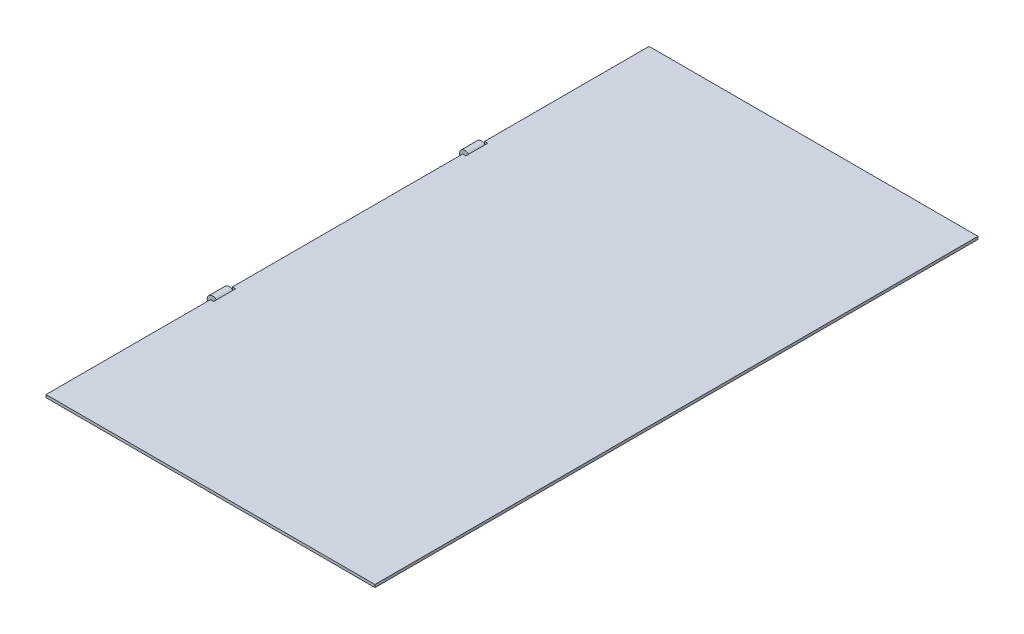
ISO-10303-21;
HEADER;
FILE_DESCRIPTION(('STEP AP214'),'2;1');
FILE_NAME('part.step','',(''),(''),'','','');
FILE_SCHEMA(('AUTOMOTIVE_DESIGN { 1 0 10303 214 1 1 1 1 }'));
ENDSEC;
DATA;
#1=APPLICATION_CONTEXT('core data for automotive mechanical design processes');
#2=APPLICATION_PROTOCOL_DEFINITION('international standard','automotive_design',2000,#1);
#3=PRODUCT_CONTEXT('',#1,'mechanical');
#4=PRODUCT('Part','Part','',(#3));
#5=PRODUCT_RELATED_PRODUCT_CATEGORY('part','',(#4));
#6=PRODUCT_DEFINITION_FORMATION('','',#4);
#7=PRODUCT_DEFINITION_CONTEXT('part definition',#1,'design');
#8=PRODUCT_DEFINITION('design','',#6,#7);
#9=PRODUCT_DEFINITION_SHAPE('','',#8);
#10=(LENGTH_UNIT() NAMED_UNIT(*) SI_UNIT(.MILLI.,.METRE.));
#11=(NAMED_UNIT(*) PLANE_ANGLE_UNIT() SI_UNIT($,.RADIAN.));
#12=(NAMED_UNIT(*) SI_UNIT($,.STERADIAN.) SOLID_ANGLE_UNIT());
#13=UNCERTAINTY_MEASURE_WITH_UNIT(LENGTH_MEASURE(1.E-05),#10,'distance_accuracy_value','');
#14=(GEOMETRIC_REPRESENTATION_CONTEXT(3) GLOBAL_UNCERTAINTY_ASSIGNED_CONTEXT((#13)) GLOBAL_UNIT_ASSIGNED_CONTEXT((#10,
#11,#12)) REPRESENTATION_CONTEXT('',''));
#15=CARTESIAN_POINT('',(0.,0.,0.));
#16=DIRECTION('',(0.,0.,1.));
#17=DIRECTION('',(1.,0.,0.));
#18=AXIS2_PLACEMENT_3D('',#15,#16,#17);
#19=CARTESIAN_POINT('',(0.,2.5,-550.));
#20=DIRECTION('',(0.,-1.,0.));
#21=DIRECTION('',(0.,0.,-1.));
#22=AXIS2_PLACEMENT_3D('',#19,#20,#21);
#23=PLANE('',#22);
#24=DIRECTION('',(1.,0.,0.));
#25=VECTOR('',#24,1.);
#26=CARTESIAN_POINT('',(0.,2.5,-400.));
#27=LINE('',#26,#25);
#28=CARTESIAN_POINT('',(0.,2.5,-400.));
#29=VERTEX_POINT('',#28);
#30=CARTESIAN_POINT('',(2.93475806736018,2.5,-400.));
#31=VERTEX_POINT('',#30);
#32=EDGE_CURVE('E329',#29,#31,#27,.T.);
#33=ORIENTED_EDGE('',*,*,#32,.T.);
#34=DIRECTION('',(0.,0.,1.));
#35=VECTOR('',#34,1.);
#36=CARTESIAN_POINT('',(2.93475806736018,2.5,-400.));
#37=LINE('',#36,#35);
#38=CARTESIAN_POINT('',(2.93475806736018,2.5,-397.5));
#39=VERTEX_POINT('',#38);
#40=EDGE_CURVE('E179',#31,#39,#37,.T.);
#41=ORIENTED_EDGE('',*,*,#40,.T.);
#42=DIRECTION('',(0.,0.,-1.));
#43=VECTOR('',#42,1.);
#44=CARTESIAN_POINT('',(2.93475806736018,2.5,-382.5));
#45=LINE('',#44,#43);
#46=CARTESIAN_POINT('',(2.93475806736018,2.5,-382.5));
#47=VERTEX_POINT('',#46);
#48=EDGE_CURVE('E196',#47,#39,#45,.T.);
#49=ORIENTED_EDGE('',*,*,#48,.F.);
#50=DIRECTION('',(0.,0.,-1.));
#51=VECTOR('',#50,1.);
#52=CARTESIAN_POINT('',(2.93475806736018,2.5,-380.));
#53=LINE('',#52,#51);
#54=CARTESIAN_POINT('',(2.93475806736018,2.5,-380.));
#55=VERTEX_POINT('',#54);
#56=EDGE_CURVE('E322',#55,#47,#53,.T.);
#57=ORIENTED_EDGE('',*,*,#56,.F.);
#58=DIRECTION('',(-1.,0.,0.));
#59=VECTOR('',#58,1.);
#60=CARTESIAN_POINT('',(0.,2.5,-380.));
#61=LINE('',#60,#59);
#62=CARTESIAN_POINT('',(0.,2.5,-380.));
#63=VERTEX_POINT('',#62);
#64=EDGE_CURVE('E317',#55,#63,#61,.T.);
#65=ORIENTED_EDGE('',*,*,#64,.T.);
#66=DIRECTION('',(0.,0.,1.));
#67=VECTOR('',#66,1.);
#68=CARTESIAN_POINT('',(0.,2.5,0.));
#69=LINE('',#68,#67);
#70=CARTESIAN_POINT('',(0.,2.5,-170.));
#71=VERTEX_POINT('',#70);
#72=EDGE_CURVE('E223',#63,#71,#69,.T.);
#73=ORIENTED_EDGE('',*,*,#72,.T.);
#74=DIRECTION('',(1.,0.,0.));
#75=VECTOR('',#74,1.);
#76=CARTESIAN_POINT('',(0.,2.5,-170.));
#77=LINE('',#76,#75);
#78=CARTESIAN_POINT('',(2.93475806736018,2.5,-170.));
#79=VERTEX_POINT('',#78);
#80=EDGE_CURVE('E303',#71,#79,#77,.T.);
#81=ORIENTED_EDGE('',*,*,#80,.T.);
#82=DIRECTION('',(0.,0.,1.));
#83=VECTOR('',#82,1.);
#84=CARTESIAN_POINT('',(2.93475806736018,2.5,-170.));
#85=LINE('',#84,#83);
#86=CARTESIAN_POINT('',(2.93475806736018,2.5,-167.5));
#87=VERTEX_POINT('',#86);
#88=EDGE_CURVE('E309',#79,#87,#85,.T.);
#89=ORIENTED_EDGE('',*,*,#88,.T.);
#90=DIRECTION('',(0.,0.,1.));
#91=VECTOR('',#90,1.);
#92=CARTESIAN_POINT('',(2.93475806736018,2.5,-167.5));
#93=LINE('',#92,#91);
#94=CARTESIAN_POINT('',(2.93475806736018,2.5,-152.5));
#95=VERTEX_POINT('',#94);
#96=EDGE_CURVE('E235',#87,#95,#93,.T.);
#97=ORIENTED_EDGE('',*,*,#96,.T.);
#98=DIRECTION('',(0.,0.,-1.));
#99=VECTOR('',#98,1.);
#100=CARTESIAN_POINT('',(2.93475806736018,2.5,-150.));
#101=LINE('',#100,#99);
#102=CARTESIAN_POINT('',(2.93475806736018,2.5,-150.));
#103=VERTEX_POINT('',#102);
#104=EDGE_CURVE('E294',#103,#95,#101,.T.);
#105=ORIENTED_EDGE('',*,*,#104,.F.);
#106=DIRECTION('',(-1.,0.,0.));
#107=VECTOR('',#106,1.);
#108=CARTESIAN_POINT('',(0.,2.5,-150.));
#109=LINE('',#108,#107);
#110=CARTESIAN_POINT('',(0.,2.5,-150.));
#111=VERTEX_POINT('',#110);
#112=EDGE_CURVE('E288',#103,#111,#109,.T.);
#113=ORIENTED_EDGE('',*,*,#112,.T.);
#114=CARTESIAN_POINT('',(0.,2.5,0.));
#115=VERTEX_POINT('',#114);
#116=EDGE_CURVE('E93',#111,#115,#69,.T.);
#117=ORIENTED_EDGE('',*,*,#116,.T.);
#118=DIRECTION('',(1.,0.,0.));
#119=VECTOR('',#118,1.);
#120=CARTESIAN_POINT('',(0.,2.5,0.));
#121=LINE('',#120,#119);
#122=CARTESIAN_POINT('',(300.,2.5,0.));
#123=VERTEX_POINT('',#122);
#124=EDGE_CURVE('E253',#115,#123,#121,.T.);
#125=ORIENTED_EDGE('',*,*,#124,.T.);
#126=DIRECTION('',(0.,0.,-1.));
#127=VECTOR('',#126,1.);
#128=CARTESIAN_POINT('',(300.,2.5,0.));
#129=LINE('',#128,#127);
#130=CARTESIAN_POINT('',(300.,2.5,-550.));
#131=VERTEX_POINT('',#130);
#132=EDGE_CURVE('E264',#123,#131,#129,.T.);
#133=ORIENTED_EDGE('',*,*,#132,.T.);
#134=DIRECTION('',(-1.,0.,0.));
#135=VECTOR('',#134,1.);
#136=CARTESIAN_POINT('',(0.,2.5,-550.));
#137=LINE('',#136,#135);
#138=CARTESIAN_POINT('',(0.,2.5,-550.));
#139=VERTEX_POINT('',#138);
#140=EDGE_CURVE('E62',#131,#139,#137,.T.);
#141=ORIENTED_EDGE('',*,*,#140,.T.);
#142=EDGE_CURVE('E262',#139,#29,#69,.T.);
#143=ORIENTED_EDGE('',*,*,#142,.T.);
#144=EDGE_LOOP('',(#33,#41,#49,#57,#65,#73,#81,#89,#97,#105,#113,#117,#125,#133,#141,#143));
#145=FACE_BOUND('',#144,.T.);
#146=ADVANCED_FACE('F45',(#145),#23,.F.);
#147=CARTESIAN_POINT('',(0.,0.,-550.));
#148=DIRECTION('',(0.,-1.,0.));
#149=DIRECTION('',(0.,0.,-1.));
#150=AXIS2_PLACEMENT_3D('',#147,#148,#149);
#151=PLANE('',#150);
#152=DIRECTION('',(0.,0.,1.));
#153=VECTOR('',#152,1.);
#154=CARTESIAN_POINT('',(4.38148398047336,0.,-400.));
#155=LINE('',#154,#153);
#156=CARTESIAN_POINT('',(4.38148398047336,0.,-400.));
#157=VERTEX_POINT('',#156);
#158=CARTESIAN_POINT('',(4.38148398047336,0.,-397.5));
#159=VERTEX_POINT('',#158);
#160=EDGE_CURVE('E169',#157,#159,#155,.T.);
#161=ORIENTED_EDGE('',*,*,#160,.F.);
#162=DIRECTION('',(1.,0.,0.));
#163=VECTOR('',#162,1.);
#164=CARTESIAN_POINT('',(0.,0.,-400.));
#165=LINE('',#164,#163);
#166=CARTESIAN_POINT('',(0.,0.,-400.));
#167=VERTEX_POINT('',#166);
#168=EDGE_CURVE('E258',#167,#157,#165,.T.);
#169=ORIENTED_EDGE('',*,*,#168,.F.);
#170=DIRECTION('',(0.,0.,1.));
#171=VECTOR('',#170,1.);
#172=CARTESIAN_POINT('',(0.,0.,0.));
#173=LINE('',#172,#171);
#174=CARTESIAN_POINT('',(0.,0.,-550.));
#175=VERTEX_POINT('',#174);
#176=EDGE_CURVE('E230',#175,#167,#173,.T.);
#177=ORIENTED_EDGE('',*,*,#176,.F.);
#178=DIRECTION('',(-1.,0.,0.));
#179=VECTOR('',#178,1.);
#180=CARTESIAN_POINT('',(0.,0.,-550.));
#181=LINE('',#180,#179);
#182=CARTESIAN_POINT('',(300.,0.,-550.));
#183=VERTEX_POINT('',#182);
#184=EDGE_CURVE('E86',#183,#175,#181,.T.);
#185=ORIENTED_EDGE('',*,*,#184,.F.);
#186=DIRECTION('',(0.,0.,-1.));
#187=VECTOR('',#186,1.);
#188=CARTESIAN_POINT('',(300.,0.,0.));
#189=LINE('',#188,#187);
#190=CARTESIAN_POINT('',(300.,0.,0.));
#191=VERTEX_POINT('',#190);
#192=EDGE_CURVE('E80',#191,#183,#189,.T.);
#193=ORIENTED_EDGE('',*,*,#192,.F.);
#194=DIRECTION('',(1.,0.,0.));
#195=VECTOR('',#194,1.);
#196=CARTESIAN_POINT('',(0.,0.,0.));
#197=LINE('',#196,#195);
#198=CARTESIAN_POINT('',(0.,0.,0.));
#199=VERTEX_POINT('',#198);
#200=EDGE_CURVE('E234',#199,#191,#197,.T.);
#201=ORIENTED_EDGE('',*,*,#200,.F.);
#202=CARTESIAN_POINT('',(0.,0.,-150.));
#203=VERTEX_POINT('',#202);
#204=EDGE_CURVE('E231',#203,#199,#173,.T.);
#205=ORIENTED_EDGE('',*,*,#204,.F.);
#206=DIRECTION('',(-1.,0.,0.));
#207=VECTOR('',#206,1.);
#208=CARTESIAN_POINT('',(0.,0.,-150.));
#209=LINE('',#208,#207);
#210=CARTESIAN_POINT('',(4.38148398047336,0.,-150.));
#211=VERTEX_POINT('',#210);
#212=EDGE_CURVE('E292',#211,#203,#209,.T.);
#213=ORIENTED_EDGE('',*,*,#212,.F.);
#214=DIRECTION('',(0.,0.,-1.));
#215=VECTOR('',#214,1.);
#216=CARTESIAN_POINT('',(4.38148398047336,0.,-150.));
#217=LINE('',#216,#215);
#218=CARTESIAN_POINT('',(4.38148398047336,0.,-152.5));
#219=VERTEX_POINT('',#218);
#220=EDGE_CURVE('E296',#211,#219,#217,.T.);
#221=ORIENTED_EDGE('',*,*,#220,.T.);
#222=DIRECTION('',(0.,0.,1.));
#223=VECTOR('',#222,1.);
#224=CARTESIAN_POINT('',(4.38148398047336,0.,-167.5));
#225=LINE('',#224,#223);
#226=CARTESIAN_POINT('',(4.38148398047336,0.,-167.5));
#227=VERTEX_POINT('',#226);
#228=EDGE_CURVE('E205',#227,#219,#225,.T.);
#229=ORIENTED_EDGE('',*,*,#228,.F.);
#230=DIRECTION('',(0.,0.,1.));
#231=VECTOR('',#230,1.);
#232=CARTESIAN_POINT('',(4.38148398047336,0.,-170.));
#233=LINE('',#232,#231);
#234=CARTESIAN_POINT('',(4.38148398047336,0.,-170.));
#235=VERTEX_POINT('',#234);
#236=EDGE_CURVE('E312',#235,#227,#233,.T.);
#237=ORIENTED_EDGE('',*,*,#236,.F.);
#238=DIRECTION('',(1.,0.,0.));
#239=VECTOR('',#238,1.);
#240=CARTESIAN_POINT('',(0.,0.,-170.));
#241=LINE('',#240,#239);
#242=CARTESIAN_POINT('',(0.,0.,-170.));
#243=VERTEX_POINT('',#242);
#244=EDGE_CURVE('E229',#243,#235,#241,.T.);
#245=ORIENTED_EDGE('',*,*,#244,.F.);
#246=CARTESIAN_POINT('',(0.,0.,-380.));
#247=VERTEX_POINT('',#246);
#248=EDGE_CURVE('E221',#247,#243,#173,.T.);
#249=ORIENTED_EDGE('',*,*,#248,.F.);
#250=DIRECTION('',(-1.,0.,0.));
#251=VECTOR('',#250,1.);
#252=CARTESIAN_POINT('',(0.,0.,-380.));
#253=LINE('',#252,#251);
#254=CARTESIAN_POINT('',(4.38148398047336,0.,-380.));
#255=VERTEX_POINT('',#254);
#256=EDGE_CURVE('E227',#255,#247,#253,.T.);
#257=ORIENTED_EDGE('',*,*,#256,.F.);
#258=DIRECTION('',(0.,0.,-1.));
#259=VECTOR('',#258,1.);
#260=CARTESIAN_POINT('',(4.38148398047336,0.,-380.));
#261=LINE('',#260,#259);
#262=CARTESIAN_POINT('',(4.38148398047336,0.,-382.5));
#263=VERTEX_POINT('',#262);
#264=EDGE_CURVE('E203',#255,#263,#261,.T.);
#265=ORIENTED_EDGE('',*,*,#264,.T.);
#266=DIRECTION('',(0.,0.,-1.));
#267=VECTOR('',#266,1.);
#268=CARTESIAN_POINT('',(4.38148398047336,0.,-382.5));
#269=LINE('',#268,#267);
#270=EDGE_CURVE('E193',#263,#159,#269,.T.);
#271=ORIENTED_EDGE('',*,*,#270,.T.);
#272=EDGE_LOOP('',(#161,#169,#177,#185,#193,#201,#205,#213,#221,#229,#237,#245,#249,#257,#265,#271));
#273=FACE_BOUND('',#272,.T.);
#274=ADVANCED_FACE('F201',(#273),#151,.T.);
#275=CARTESIAN_POINT('',(0.,2.5,0.));
#276=DIRECTION('',(1.,0.,0.));
#277=DIRECTION('',(0.,0.,-1.));
#278=AXIS2_PLACEMENT_3D('',#275,#276,#277);
#279=PLANE('',#278);
#280=ORIENTED_EDGE('',*,*,#72,.F.);
#281=DIRECTION('',(0.,-1.,0.));
#282=VECTOR('',#281,1.);
#283=CARTESIAN_POINT('',(0.,2.5,-380.));
#284=LINE('',#283,#282);
#285=EDGE_CURVE('E54',#63,#247,#284,.T.);
#286=ORIENTED_EDGE('',*,*,#285,.T.);
#287=ORIENTED_EDGE('',*,*,#248,.T.);
#288=DIRECTION('',(0.,1.,0.));
#289=VECTOR('',#288,1.);
#290=CARTESIAN_POINT('',(0.,2.5,-170.));
#291=LINE('',#290,#289);
#292=EDGE_CURVE('E208',#243,#71,#291,.T.);
#293=ORIENTED_EDGE('',*,*,#292,.T.);
#294=EDGE_LOOP('',(#280,#286,#287,#293));
#295=FACE_BOUND('',#294,.T.);
#296=ADVANCED_FACE('F220',(#295),#279,.F.);
#297=ORIENTED_EDGE('',*,*,#176,.T.);
#298=DIRECTION('',(0.,1.,0.));
#299=VECTOR('',#298,1.);
#300=CARTESIAN_POINT('',(0.,2.5,-400.));
#301=LINE('',#300,#299);
#302=EDGE_CURVE('E12',#167,#29,#301,.T.);
#303=ORIENTED_EDGE('',*,*,#302,.T.);
#304=ORIENTED_EDGE('',*,*,#142,.F.);
#305=DIRECTION('',(0.,-1.,0.));
#306=VECTOR('',#305,1.);
#307=CARTESIAN_POINT('',(0.,2.5,-550.));
#308=LINE('',#307,#306);
#309=EDGE_CURVE('E242',#139,#175,#308,.T.);
#310=ORIENTED_EDGE('',*,*,#309,.T.);
#311=EDGE_LOOP('',(#297,#303,#304,#310));
#312=FACE_BOUND('',#311,.T.);
#313=ADVANCED_FACE('F260',(#312),#279,.F.);
#314=ORIENTED_EDGE('',*,*,#116,.F.);
#315=DIRECTION('',(0.,-1.,0.));
#316=VECTOR('',#315,1.);
#317=CARTESIAN_POINT('',(0.,2.5,-150.));
#318=LINE('',#317,#316);
#319=EDGE_CURVE('E204',#111,#203,#318,.T.);
#320=ORIENTED_EDGE('',*,*,#319,.T.);
#321=ORIENTED_EDGE('',*,*,#204,.T.);
#322=DIRECTION('',(0.,-1.,0.));
#323=VECTOR('',#322,1.);
#324=CARTESIAN_POINT('',(0.,2.5,0.));
#325=LINE('',#324,#323);
#326=EDGE_CURVE('E211',#115,#199,#325,.T.);
#327=ORIENTED_EDGE('',*,*,#326,.F.);
#328=EDGE_LOOP('',(#314,#320,#321,#327));
#329=FACE_BOUND('',#328,.T.);
#330=ADVANCED_FACE('F47',(#329),#279,.F.);
#331=CARTESIAN_POINT('',(0.,2.5,0.));
#332=DIRECTION('',(0.,0.,-1.));
#333=DIRECTION('',(-1.,0.,0.));
#334=AXIS2_PLACEMENT_3D('',#331,#332,#333);
#335=PLANE('',#334);
#336=ORIENTED_EDGE('',*,*,#200,.T.);
#337=DIRECTION('',(0.,-1.,0.));
#338=VECTOR('',#337,1.);
#339=CARTESIAN_POINT('',(300.,2.5,0.));
#340=LINE('',#339,#338);
#341=EDGE_CURVE('E246',#123,#191,#340,.T.);
#342=ORIENTED_EDGE('',*,*,#341,.F.);
#343=ORIENTED_EDGE('',*,*,#124,.F.);
#344=ORIENTED_EDGE('',*,*,#326,.T.);
#345=EDGE_LOOP('',(#336,#342,#343,#344));
#346=FACE_BOUND('',#345,.T.);
#347=ADVANCED_FACE('F250',(#346),#335,.F.);
#348=CARTESIAN_POINT('',(300.,2.5,0.));
#349=DIRECTION('',(-1.,0.,0.));
#350=DIRECTION('',(0.,0.,1.));
#351=AXIS2_PLACEMENT_3D('',#348,#349,#350);
#352=PLANE('',#351);
#353=ORIENTED_EDGE('',*,*,#192,.T.);
#354=DIRECTION('',(0.,-1.,0.));
#355=VECTOR('',#354,1.);
#356=CARTESIAN_POINT('',(300.,2.5,-550.));
#357=LINE('',#356,#355);
#358=EDGE_CURVE('E244',#131,#183,#357,.T.);
#359=ORIENTED_EDGE('',*,*,#358,.F.);
#360=ORIENTED_EDGE('',*,*,#132,.F.);
#361=ORIENTED_EDGE('',*,*,#341,.T.);
#362=EDGE_LOOP('',(#353,#359,#360,#361));
#363=FACE_BOUND('',#362,.T.);
#364=ADVANCED_FACE('F377',(#363),#352,.F.);
#365=CARTESIAN_POINT('',(0.,2.5,-550.));
#366=DIRECTION('',(0.,0.,1.));
#367=DIRECTION('',(1.,0.,0.));
#368=AXIS2_PLACEMENT_3D('',#365,#366,#367);
#369=PLANE('',#368);
#370=ORIENTED_EDGE('',*,*,#184,.T.);
#371=ORIENTED_EDGE('',*,*,#309,.F.);
#372=ORIENTED_EDGE('',*,*,#140,.F.);
#373=ORIENTED_EDGE('',*,*,#358,.T.);
#374=EDGE_LOOP('',(#370,#371,#372,#373));
#375=FACE_BOUND('',#374,.T.);
#376=ADVANCED_FACE('F263',(#375),#369,.F.);
#377=CARTESIAN_POINT('',(-0.485034727591443,-1.14760431510835,-167.5));
#378=DIRECTION('',(0.,0.,1.));
#379=DIRECTION('',(1.,0.,0.));
#380=AXIS2_PLACEMENT_3D('',#377,#378,#379);
#381=CYLINDRICAL_SURFACE('',#380,5.);
#382=ORIENTED_EDGE('',*,*,#96,.F.);
#383=CARTESIAN_POINT('',(-0.485034727591443,-1.14760431510835,-167.5));
#384=DIRECTION('',(0.,0.,1.));
#385=DIRECTION('',(1.,0.,0.));
#386=AXIS2_PLACEMENT_3D('',#383,#384,#385);
#387=CIRCLE('',#386,5.);
#388=EDGE_CURVE('E271',#87,#227,#387,.T.);
#389=ORIENTED_EDGE('',*,*,#388,.T.);
#390=ORIENTED_EDGE('',*,*,#228,.T.);
#391=CARTESIAN_POINT('',(-0.485034727591443,-1.14760431510835,-152.5));
#392=DIRECTION('',(0.,0.,1.));
#393=DIRECTION('',(1.,0.,0.));
#394=AXIS2_PLACEMENT_3D('',#391,#392,#393);
#395=CIRCLE('',#394,5.);
#396=EDGE_CURVE('E272',#95,#219,#395,.T.);
#397=ORIENTED_EDGE('',*,*,#396,.F.);
#398=EDGE_LOOP('',(#382,#389,#390,#397));
#399=FACE_BOUND('',#398,.T.);
#400=ADVANCED_FACE('F372',(#399),#381,.T.);
#401=CARTESIAN_POINT('',(-0.485034727591443,-1.14760431510835,-167.5));
#402=DIRECTION('',(0.,0.,1.));
#403=DIRECTION('',(1.,0.,0.));
#404=AXIS2_PLACEMENT_3D('',#401,#402,#403);
#405=PLANE('',#404);
#406=CARTESIAN_POINT('',(-0.485034727591443,-1.14760431510835,-167.5));
#407=DIRECTION('',(0.,0.,1.));
#408=DIRECTION('',(1.,0.,0.));
#409=AXIS2_PLACEMENT_3D('',#406,#407,#408);
#410=CIRCLE('',#409,1.245895);
#411=CARTESIAN_POINT('',(0.760860272408557,-1.14760431510835,-167.5));
#412=VERTEX_POINT('',#411);
#413=EDGE_CURVE('E275',#412,#412,#410,.T.);
#414=ORIENTED_EDGE('',*,*,#413,.T.);
#415=EDGE_LOOP('',(#414));
#416=FACE_BOUND('',#415,.T.);
#417=ORIENTED_EDGE('',*,*,#388,.F.);
#418=CARTESIAN_POINT('',(-0.485034727591443,-1.14760431510835,-167.5));
#419=DIRECTION('',(0.,0.,1.));
#420=DIRECTION('',(1.,0.,0.));
#421=AXIS2_PLACEMENT_3D('',#418,#419,#420);
#422=CIRCLE('',#421,5.);
#423=EDGE_CURVE('E315',#227,#87,#422,.T.);
#424=ORIENTED_EDGE('',*,*,#423,.F.);
#425=EDGE_LOOP('',(#417,#424));
#426=FACE_BOUND('',#425,.T.);
#427=ADVANCED_FACE('F487',(#416,#426),#405,.F.);
#428=CARTESIAN_POINT('',(-0.485034727591443,-1.14760431510835,-152.5));
#429=DIRECTION('',(0.,0.,1.));
#430=DIRECTION('',(1.,0.,0.));
#431=AXIS2_PLACEMENT_3D('',#428,#429,#430);
#432=PLANE('',#431);
#433=CARTESIAN_POINT('',(-0.485034727591443,-1.14760431510835,-152.5));
#434=DIRECTION('',(0.,0.,1.));
#435=DIRECTION('',(1.,0.,0.));
#436=AXIS2_PLACEMENT_3D('',#433,#434,#435);
#437=CIRCLE('',#436,1.245895);
#438=CARTESIAN_POINT('',(0.760860272408557,-1.14760431510835,-152.5));
#439=VERTEX_POINT('',#438);
#440=EDGE_CURVE('E278',#439,#439,#437,.T.);
#441=ORIENTED_EDGE('',*,*,#440,.F.);
#442=EDGE_LOOP('',(#441));
#443=FACE_BOUND('',#442,.T.);
#444=CARTESIAN_POINT('',(-0.485034727591443,-1.14760431510835,-152.5));
#445=DIRECTION('',(0.,0.,1.));
#446=DIRECTION('',(1.,0.,0.));
#447=AXIS2_PLACEMENT_3D('',#444,#445,#446);
#448=CIRCLE('',#447,5.);
#449=EDGE_CURVE('E300',#219,#95,#448,.T.);
#450=ORIENTED_EDGE('',*,*,#449,.T.);
#451=ORIENTED_EDGE('',*,*,#396,.T.);
#452=EDGE_LOOP('',(#450,#451));
#453=FACE_BOUND('',#452,.T.);
#454=ADVANCED_FACE('F478',(#443,#453),#432,.T.);
#455=CARTESIAN_POINT('',(-0.485034727591443,-1.14760431510835,-167.5));
#456=DIRECTION('',(0.,0.,1.));
#457=DIRECTION('',(1.,0.,0.));
#458=AXIS2_PLACEMENT_3D('',#455,#456,#457);
#459=CYLINDRICAL_SURFACE('',#458,1.245895);
#460=ORIENTED_EDGE('',*,*,#440,.T.);
#461=EDGE_LOOP('',(#460));
#462=FACE_BOUND('',#461,.T.);
#463=ORIENTED_EDGE('',*,*,#413,.F.);
#464=EDGE_LOOP('',(#463));
#465=FACE_BOUND('',#464,.T.);
#466=ADVANCED_FACE('F346',(#462,#465),#459,.F.);
#467=CARTESIAN_POINT('',(-0.485034727591443,-1.14760431510835,-382.5));
#468=DIRECTION('',(0.,0.,-1.));
#469=DIRECTION('',(1.,0.,0.));
#470=AXIS2_PLACEMENT_3D('',#467,#468,#469);
#471=PLANE('',#470);
#472=CARTESIAN_POINT('',(-0.485034727591443,-1.14760431510835,-382.5));
#473=DIRECTION('',(0.,0.,1.));
#474=DIRECTION('',(1.,0.,0.));
#475=AXIS2_PLACEMENT_3D('',#472,#473,#474);
#476=CIRCLE('',#475,5.);
#477=EDGE_CURVE('E326',#263,#47,#476,.T.);
#478=ORIENTED_EDGE('',*,*,#477,.T.);
#479=CARTESIAN_POINT('',(-0.485034727591443,-1.14760431510835,-382.5));
#480=DIRECTION('',(0.,0.,1.));
#481=DIRECTION('',(1.,0.,0.));
#482=AXIS2_PLACEMENT_3D('',#479,#480,#481);
#483=CIRCLE('',#482,5.);
#484=EDGE_CURVE('E197',#47,#263,#483,.T.);
#485=ORIENTED_EDGE('',*,*,#484,.T.);
#486=EDGE_LOOP('',(#478,#485));
#487=FACE_BOUND('',#486,.T.);
#488=CARTESIAN_POINT('',(-0.485034727591443,-1.14760431510835,-382.5));
#489=DIRECTION('',(0.,0.,1.));
#490=DIRECTION('',(1.,0.,0.));
#491=AXIS2_PLACEMENT_3D('',#488,#489,#490);
#492=CIRCLE('',#491,1.245895);
#493=CARTESIAN_POINT('',(0.760860272408557,-1.14760431510835,-382.5));
#494=VERTEX_POINT('',#493);
#495=EDGE_CURVE('E198',#494,#494,#492,.T.);
#496=ORIENTED_EDGE('',*,*,#495,.F.);
#497=EDGE_LOOP('',(#496));
#498=FACE_BOUND('',#497,.T.);
#499=ADVANCED_FACE('F343',(#487,#498),#471,.F.);
#500=CARTESIAN_POINT('',(-0.485034727591443,-1.14760431510835,-397.5));
#501=DIRECTION('',(0.,0.,-1.));
#502=DIRECTION('',(1.,0.,0.));
#503=AXIS2_PLACEMENT_3D('',#500,#501,#502);
#504=PLANE('',#503);
#505=CARTESIAN_POINT('',(-0.485034727591443,-1.14760431510835,-397.5));
#506=DIRECTION('',(0.,0.,1.));
#507=DIRECTION('',(1.,0.,0.));
#508=AXIS2_PLACEMENT_3D('',#505,#506,#507);
#509=CIRCLE('',#508,5.);
#510=EDGE_CURVE('E186',#39,#159,#509,.T.);
#511=ORIENTED_EDGE('',*,*,#510,.F.);
#512=CARTESIAN_POINT('',(-0.485034727591443,-1.14760431510835,-397.5));
#513=DIRECTION('',(0.,0.,1.));
#514=DIRECTION('',(1.,0.,0.));
#515=AXIS2_PLACEMENT_3D('',#512,#513,#514);
#516=CIRCLE('',#515,5.);
#517=EDGE_CURVE('E172',#159,#39,#516,.T.);
#518=ORIENTED_EDGE('',*,*,#517,.F.);
#519=EDGE_LOOP('',(#511,#518));
#520=FACE_BOUND('',#519,.T.);
#521=CARTESIAN_POINT('',(-0.485034727591443,-1.14760431510835,-397.5));
#522=DIRECTION('',(0.,0.,1.));
#523=DIRECTION('',(1.,0.,0.));
#524=AXIS2_PLACEMENT_3D('',#521,#522,#523);
#525=CIRCLE('',#524,1.245895);
#526=CARTESIAN_POINT('',(0.760860272408557,-1.14760431510835,-397.5));
#527=VERTEX_POINT('',#526);
#528=EDGE_CURVE('E285',#527,#527,#525,.T.);
#529=ORIENTED_EDGE('',*,*,#528,.T.);
#530=EDGE_LOOP('',(#529));
#531=FACE_BOUND('',#530,.T.);
#532=ADVANCED_FACE('F184',(#520,#531),#504,.T.);
#533=CARTESIAN_POINT('',(-0.485034727591443,-1.14760431510835,-382.5));
#534=DIRECTION('',(0.,0.,-1.));
#535=DIRECTION('',(-1.,0.,0.));
#536=AXIS2_PLACEMENT_3D('',#533,#534,#535);
#537=CYLINDRICAL_SURFACE('',#536,5.);
#538=ORIENTED_EDGE('',*,*,#484,.F.);
#539=ORIENTED_EDGE('',*,*,#48,.T.);
#540=ORIENTED_EDGE('',*,*,#510,.T.);
#541=ORIENTED_EDGE('',*,*,#270,.F.);
#542=EDGE_LOOP('',(#538,#539,#540,#541));
#543=FACE_BOUND('',#542,.T.);
#544=ADVANCED_FACE('F192',(#543),#537,.T.);
#545=CARTESIAN_POINT('',(-0.485034727591443,-1.14760431510835,-382.5));
#546=DIRECTION('',(0.,0.,-1.));
#547=DIRECTION('',(-1.,0.,0.));
#548=AXIS2_PLACEMENT_3D('',#545,#546,#547);
#549=CYLINDRICAL_SURFACE('',#548,1.245895);
#550=ORIENTED_EDGE('',*,*,#528,.F.);
#551=EDGE_LOOP('',(#550));
#552=FACE_BOUND('',#551,.T.);
#553=ORIENTED_EDGE('',*,*,#495,.T.);
#554=EDGE_LOOP('',(#553));
#555=FACE_BOUND('',#554,.T.);
#556=ADVANCED_FACE('F350',(#552,#555),#549,.F.);
#557=CARTESIAN_POINT('',(-0.485034727591443,-1.14760431510835,-150.));
#558=DIRECTION('',(0.,0.,1.));
#559=DIRECTION('',(1.,0.,0.));
#560=AXIS2_PLACEMENT_3D('',#557,#558,#559);
#561=PLANE('',#560);
#562=CARTESIAN_POINT('',(-0.485034727591443,-1.14760431510835,-150.));
#563=DIRECTION('',(0.,0.,1.));
#564=DIRECTION('',(1.,0.,0.));
#565=AXIS2_PLACEMENT_3D('',#562,#563,#564);
#566=CIRCLE('',#565,5.);
#567=EDGE_CURVE('E299',#211,#103,#566,.T.);
#568=ORIENTED_EDGE('',*,*,#567,.F.);
#569=ORIENTED_EDGE('',*,*,#212,.T.);
#570=ORIENTED_EDGE('',*,*,#319,.F.);
#571=ORIENTED_EDGE('',*,*,#112,.F.);
#572=EDGE_LOOP('',(#568,#569,#570,#571));
#573=FACE_BOUND('',#572,.T.);
#574=ADVANCED_FACE('F352',(#573),#561,.F.);
#575=CARTESIAN_POINT('',(-0.485034727591443,-1.14760431510835,-150.));
#576=DIRECTION('',(0.,0.,-1.));
#577=DIRECTION('',(-1.,0.,0.));
#578=AXIS2_PLACEMENT_3D('',#575,#576,#577);
#579=CYLINDRICAL_SURFACE('',#578,5.);
#580=ORIENTED_EDGE('',*,*,#104,.T.);
#581=ORIENTED_EDGE('',*,*,#449,.F.);
#582=ORIENTED_EDGE('',*,*,#220,.F.);
#583=ORIENTED_EDGE('',*,*,#567,.T.);
#584=EDGE_LOOP('',(#580,#581,#582,#583));
#585=FACE_BOUND('',#584,.T.);
#586=ADVANCED_FACE('F359',(#585),#579,.F.);
#587=CARTESIAN_POINT('',(-0.485034727591443,-1.14760431510835,-170.));
#588=DIRECTION('',(0.,0.,-1.));
#589=DIRECTION('',(1.,0.,0.));
#590=AXIS2_PLACEMENT_3D('',#587,#588,#589);
#591=PLANE('',#590);
#592=ORIENTED_EDGE('',*,*,#292,.F.);
#593=ORIENTED_EDGE('',*,*,#244,.T.);
#594=CARTESIAN_POINT('',(-0.485034727591443,-1.14760431510835,-170.));
#595=DIRECTION('',(0.,0.,1.));
#596=DIRECTION('',(1.,0.,0.));
#597=AXIS2_PLACEMENT_3D('',#594,#595,#596);
#598=CIRCLE('',#597,5.);
#599=EDGE_CURVE('E314',#235,#79,#598,.T.);
#600=ORIENTED_EDGE('',*,*,#599,.T.);
#601=ORIENTED_EDGE('',*,*,#80,.F.);
#602=EDGE_LOOP('',(#592,#593,#600,#601));
#603=FACE_BOUND('',#602,.T.);
#604=ADVANCED_FACE('F466',(#603),#591,.F.);
#605=CARTESIAN_POINT('',(-0.485034727591443,-1.14760431510835,-170.));
#606=DIRECTION('',(0.,0.,1.));
#607=DIRECTION('',(1.,0.,0.));
#608=AXIS2_PLACEMENT_3D('',#605,#606,#607);
#609=CYLINDRICAL_SURFACE('',#608,5.);
#610=ORIENTED_EDGE('',*,*,#599,.F.);
#611=ORIENTED_EDGE('',*,*,#236,.T.);
#612=ORIENTED_EDGE('',*,*,#423,.T.);
#613=ORIENTED_EDGE('',*,*,#88,.F.);
#614=EDGE_LOOP('',(#610,#611,#612,#613));
#615=FACE_BOUND('',#614,.T.);
#616=ADVANCED_FACE('F436',(#615),#609,.F.);
#617=CARTESIAN_POINT('',(-0.485034727591443,-1.14760431510835,-380.));
#618=DIRECTION('',(0.,0.,1.));
#619=DIRECTION('',(1.,0.,0.));
#620=AXIS2_PLACEMENT_3D('',#617,#618,#619);
#621=PLANE('',#620);
#622=CARTESIAN_POINT('',(-0.485034727591443,-1.14760431510835,-380.));
#623=DIRECTION('',(0.,0.,1.));
#624=DIRECTION('',(1.,0.,0.));
#625=AXIS2_PLACEMENT_3D('',#622,#623,#624);
#626=CIRCLE('',#625,5.);
#627=EDGE_CURVE('E325',#255,#55,#626,.T.);
#628=ORIENTED_EDGE('',*,*,#627,.F.);
#629=ORIENTED_EDGE('',*,*,#256,.T.);
#630=ORIENTED_EDGE('',*,*,#285,.F.);
#631=ORIENTED_EDGE('',*,*,#64,.F.);
#632=EDGE_LOOP('',(#628,#629,#630,#631));
#633=FACE_BOUND('',#632,.T.);
#634=ADVANCED_FACE('F432',(#633),#621,.F.);
#635=CARTESIAN_POINT('',(-0.485034727591443,-1.14760431510835,-380.));
#636=DIRECTION('',(0.,0.,-1.));
#637=DIRECTION('',(-1.,0.,0.));
#638=AXIS2_PLACEMENT_3D('',#635,#636,#637);
#639=CYLINDRICAL_SURFACE('',#638,5.);
#640=ORIENTED_EDGE('',*,*,#56,.T.);
#641=ORIENTED_EDGE('',*,*,#477,.F.);
#642=ORIENTED_EDGE('',*,*,#264,.F.);
#643=ORIENTED_EDGE('',*,*,#627,.T.);
#644=EDGE_LOOP('',(#640,#641,#642,#643));
#645=FACE_BOUND('',#644,.T.);
#646=ADVANCED_FACE('F340',(#645),#639,.F.);
#647=CARTESIAN_POINT('',(-0.485034727591443,-1.14760431510835,-400.));
#648=DIRECTION('',(0.,0.,-1.));
#649=DIRECTION('',(1.,0.,0.));
#650=AXIS2_PLACEMENT_3D('',#647,#648,#649);
#651=PLANE('',#650);
#652=ORIENTED_EDGE('',*,*,#302,.F.);
#653=ORIENTED_EDGE('',*,*,#168,.T.);
#654=CARTESIAN_POINT('',(-0.485034727591443,-1.14760431510835,-400.));
#655=DIRECTION('',(0.,0.,1.));
#656=DIRECTION('',(1.,0.,0.));
#657=AXIS2_PLACEMENT_3D('',#654,#655,#656);
#658=CIRCLE('',#657,5.);
#659=EDGE_CURVE('E175',#157,#31,#658,.T.);
#660=ORIENTED_EDGE('',*,*,#659,.T.);
#661=ORIENTED_EDGE('',*,*,#32,.F.);
#662=EDGE_LOOP('',(#652,#653,#660,#661));
#663=FACE_BOUND('',#662,.T.);
#664=ADVANCED_FACE('F337',(#663),#651,.F.);
#665=CARTESIAN_POINT('',(-0.485034727591443,-1.14760431510835,-400.));
#666=DIRECTION('',(0.,0.,1.));
#667=DIRECTION('',(1.,0.,0.));
#668=AXIS2_PLACEMENT_3D('',#665,#666,#667);
#669=CYLINDRICAL_SURFACE('',#668,5.);
#670=ORIENTED_EDGE('',*,*,#659,.F.);
#671=ORIENTED_EDGE('',*,*,#160,.T.);
#672=ORIENTED_EDGE('',*,*,#517,.T.);
#673=ORIENTED_EDGE('',*,*,#40,.F.);
#674=EDGE_LOOP('',(#670,#671,#672,#673));
#675=FACE_BOUND('',#674,.T.);
#676=ADVANCED_FACE('F171',(#675),#669,.F.);
#677=CLOSED_SHELL('',(#146,#274,#296,#313,#330,#347,#364,#376,#400,#427,#454,#466,#499,#532,
#544,#556,#574,#586,#604,#616,#634,#646,#664,#676));
#678=MANIFOLD_SOLID_BREP('B2',#677);
#679=ADVANCED_BREP_SHAPE_REPRESENTATION('',(#18,#678),#14);
#680=SHAPE_DEFINITION_REPRESENTATION(#9,#679);
ENDSEC;
END-ISO-10303-21;
